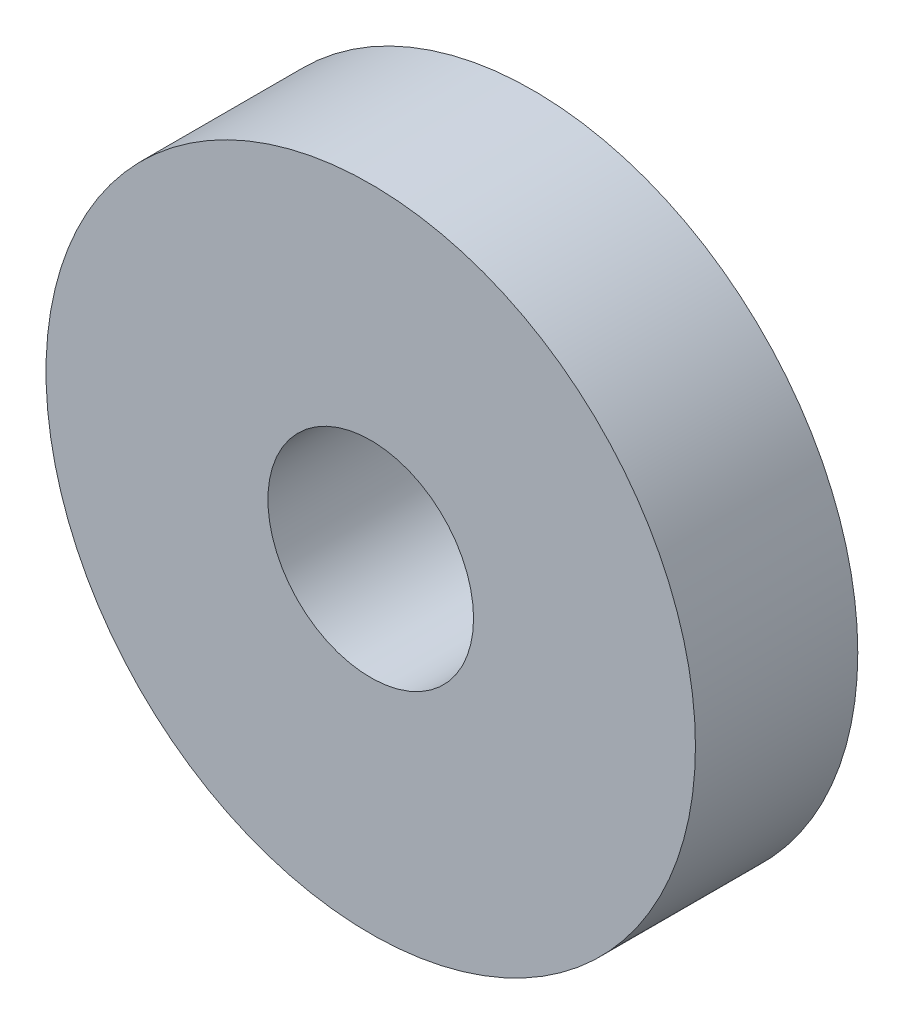
ISO-10303-21;
HEADER;
FILE_DESCRIPTION(('STEP AP214'),'2;1');
FILE_NAME('part.step','',(''),(''),'','','');
FILE_SCHEMA(('AUTOMOTIVE_DESIGN { 1 0 10303 214 1 1 1 1 }'));
ENDSEC;
DATA;
#1=APPLICATION_CONTEXT('core data for automotive mechanical design processes');
#2=APPLICATION_PROTOCOL_DEFINITION('international standard','automotive_design',2000,#1);
#3=PRODUCT_CONTEXT('',#1,'mechanical');
#4=PRODUCT('Part','Part','',(#3));
#5=PRODUCT_RELATED_PRODUCT_CATEGORY('part','',(#4));
#6=PRODUCT_DEFINITION_FORMATION('','',#4);
#7=PRODUCT_DEFINITION_CONTEXT('part definition',#1,'design');
#8=PRODUCT_DEFINITION('design','',#6,#7);
#9=PRODUCT_DEFINITION_SHAPE('','',#8);
#10=(LENGTH_UNIT() NAMED_UNIT(*) SI_UNIT(.MILLI.,.METRE.));
#11=(NAMED_UNIT(*) PLANE_ANGLE_UNIT() SI_UNIT($,.RADIAN.));
#12=(NAMED_UNIT(*) SI_UNIT($,.STERADIAN.) SOLID_ANGLE_UNIT());
#13=UNCERTAINTY_MEASURE_WITH_UNIT(LENGTH_MEASURE(1.E-05),#10,'distance_accuracy_value','');
#14=(GEOMETRIC_REPRESENTATION_CONTEXT(3) GLOBAL_UNCERTAINTY_ASSIGNED_CONTEXT((#13)) GLOBAL_UNIT_ASSIGNED_CONTEXT((#10,
#11,#12)) REPRESENTATION_CONTEXT('',''));
#15=CARTESIAN_POINT('',(0.,0.,0.));
#16=DIRECTION('',(0.,0.,1.));
#17=DIRECTION('',(1.,0.,0.));
#18=AXIS2_PLACEMENT_3D('',#15,#16,#17);
#19=CARTESIAN_POINT('',(0.,0.,0.));
#20=DIRECTION('',(0.,0.,1.));
#21=DIRECTION('',(1.,0.,0.));
#22=AXIS2_PLACEMENT_3D('',#19,#20,#21);
#23=CYLINDRICAL_SURFACE('',#22,1.9);
#24=CARTESIAN_POINT('',(0.,0.,0.));
#25=DIRECTION('',(0.,0.,1.));
#26=DIRECTION('',(1.,0.,0.));
#27=AXIS2_PLACEMENT_3D('',#24,#25,#26);
#28=CIRCLE('',#27,1.9);
#29=CARTESIAN_POINT('',(1.9,0.,0.));
#30=VERTEX_POINT('',#29);
#31=EDGE_CURVE('E26',#30,#30,#28,.T.);
#32=ORIENTED_EDGE('',*,*,#31,.F.);
#33=EDGE_LOOP('',(#32));
#34=FACE_BOUND('',#33,.T.);
#35=CARTESIAN_POINT('',(0.,0.,3.));
#36=DIRECTION('',(0.,0.,1.));
#37=DIRECTION('',(1.,0.,0.));
#38=AXIS2_PLACEMENT_3D('',#35,#36,#37);
#39=CIRCLE('',#38,1.9);
#40=CARTESIAN_POINT('',(1.9,0.,3.));
#41=VERTEX_POINT('',#40);
#42=EDGE_CURVE('E17',#41,#41,#39,.T.);
#43=ORIENTED_EDGE('',*,*,#42,.T.);
#44=EDGE_LOOP('',(#43));
#45=FACE_BOUND('',#44,.T.);
#46=ADVANCED_FACE('F14',(#34,#45),#23,.F.);
#47=CARTESIAN_POINT('',(0.,0.,3.));
#48=DIRECTION('',(0.,0.,-1.));
#49=DIRECTION('',(-1.,0.,0.));
#50=AXIS2_PLACEMENT_3D('',#47,#48,#49);
#51=PLANE('',#50);
#52=ORIENTED_EDGE('',*,*,#42,.F.);
#53=EDGE_LOOP('',(#52));
#54=FACE_BOUND('',#53,.T.);
#55=CARTESIAN_POINT('',(0.,0.,3.));
#56=DIRECTION('',(0.,0.,1.));
#57=DIRECTION('',(1.,0.,0.));
#58=AXIS2_PLACEMENT_3D('',#55,#56,#57);
#59=CIRCLE('',#58,6.);
#60=CARTESIAN_POINT('',(6.,0.,3.));
#61=VERTEX_POINT('',#60);
#62=EDGE_CURVE('E21',#61,#61,#59,.F.);
#63=ORIENTED_EDGE('',*,*,#62,.F.);
#64=EDGE_LOOP('',(#63));
#65=FACE_BOUND('',#64,.T.);
#66=ADVANCED_FACE('F35',(#54,#65),#51,.F.);
#67=CARTESIAN_POINT('',(0.,0.,0.));
#68=DIRECTION('',(0.,0.,-1.));
#69=DIRECTION('',(-1.,0.,0.));
#70=AXIS2_PLACEMENT_3D('',#67,#68,#69);
#71=PLANE('',#70);
#72=ORIENTED_EDGE('',*,*,#31,.T.);
#73=EDGE_LOOP('',(#72));
#74=FACE_BOUND('',#73,.T.);
#75=CARTESIAN_POINT('',(0.,0.,0.));
#76=DIRECTION('',(0.,0.,1.));
#77=DIRECTION('',(1.,0.,0.));
#78=AXIS2_PLACEMENT_3D('',#75,#76,#77);
#79=CIRCLE('',#78,6.);
#80=CARTESIAN_POINT('',(6.,0.,0.));
#81=VERTEX_POINT('',#80);
#82=EDGE_CURVE('E9',#81,#81,#79,.T.);
#83=ORIENTED_EDGE('',*,*,#82,.F.);
#84=EDGE_LOOP('',(#83));
#85=FACE_BOUND('',#84,.T.);
#86=ADVANCED_FACE('F38',(#74,#85),#71,.T.);
#87=CARTESIAN_POINT('',(0.,0.,0.));
#88=DIRECTION('',(0.,0.,1.));
#89=DIRECTION('',(1.,0.,0.));
#90=AXIS2_PLACEMENT_3D('',#87,#88,#89);
#91=CYLINDRICAL_SURFACE('',#90,6.);
#92=ORIENTED_EDGE('',*,*,#82,.T.);
#93=EDGE_LOOP('',(#92));
#94=FACE_BOUND('',#93,.T.);
#95=ORIENTED_EDGE('',*,*,#62,.T.);
#96=EDGE_LOOP('',(#95));
#97=FACE_BOUND('',#96,.T.);
#98=ADVANCED_FACE('F41',(#94,#97),#91,.T.);
#99=CLOSED_SHELL('',(#46,#66,#86,#98));
#100=MANIFOLD_SOLID_BREP('B1',#99);
#101=ADVANCED_BREP_SHAPE_REPRESENTATION('',(#18,#100),#14);
#102=SHAPE_DEFINITION_REPRESENTATION(#9,#101);
ENDSEC;
END-ISO-10303-21;
